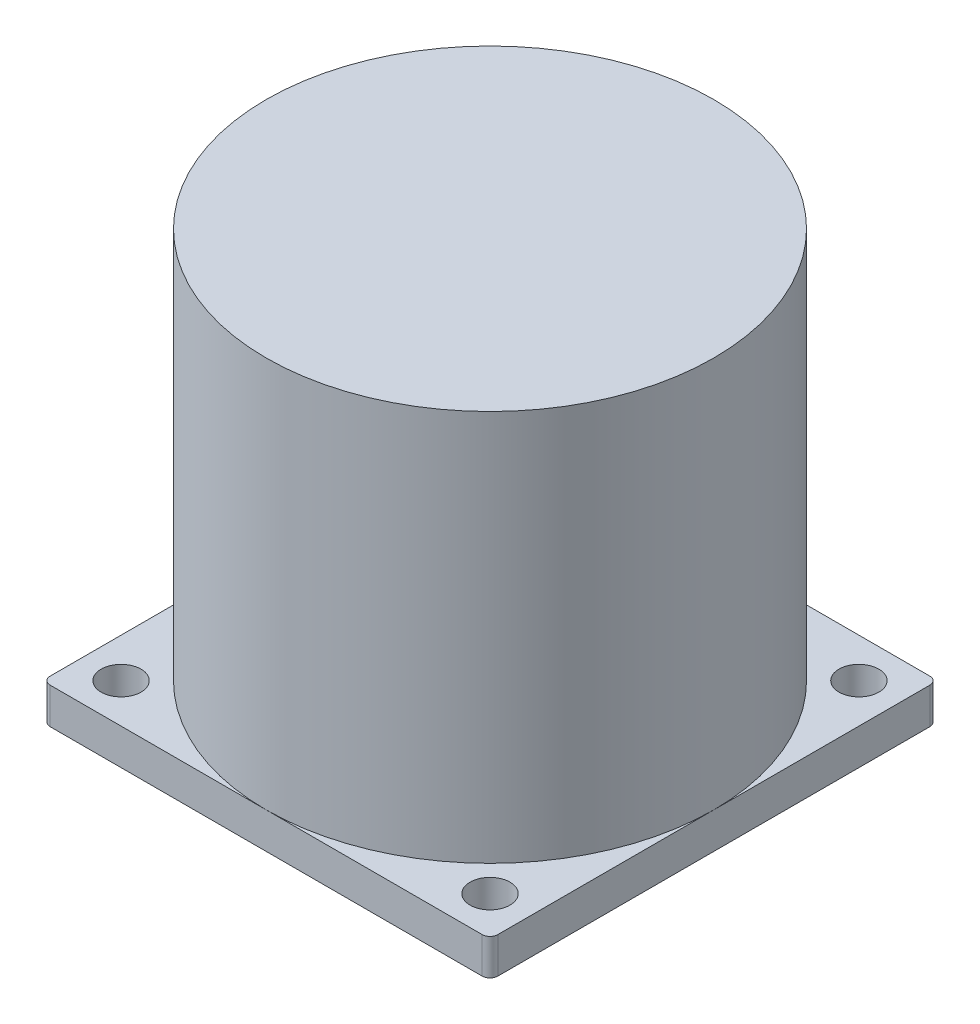
ISO-10303-21;
HEADER;
FILE_DESCRIPTION(('STEP AP214'),'2;1');
FILE_NAME('part.step','',(''),(''),'','','');
FILE_SCHEMA(('AUTOMOTIVE_DESIGN { 1 0 10303 214 1 1 1 1 }'));
ENDSEC;
DATA;
#1=APPLICATION_CONTEXT('core data for automotive mechanical design processes');
#2=APPLICATION_PROTOCOL_DEFINITION('international standard','automotive_design',2000,#1);
#3=PRODUCT_CONTEXT('',#1,'mechanical');
#4=PRODUCT('Part','Part','',(#3));
#5=PRODUCT_RELATED_PRODUCT_CATEGORY('part','',(#4));
#6=PRODUCT_DEFINITION_FORMATION('','',#4);
#7=PRODUCT_DEFINITION_CONTEXT('part definition',#1,'design');
#8=PRODUCT_DEFINITION('design','',#6,#7);
#9=PRODUCT_DEFINITION_SHAPE('','',#8);
#10=(LENGTH_UNIT() NAMED_UNIT(*) SI_UNIT(.MILLI.,.METRE.));
#11=(NAMED_UNIT(*) PLANE_ANGLE_UNIT() SI_UNIT($,.RADIAN.));
#12=(NAMED_UNIT(*) SI_UNIT($,.STERADIAN.) SOLID_ANGLE_UNIT());
#13=UNCERTAINTY_MEASURE_WITH_UNIT(LENGTH_MEASURE(1.E-05),#10,'distance_accuracy_value','');
#14=(GEOMETRIC_REPRESENTATION_CONTEXT(3) GLOBAL_UNCERTAINTY_ASSIGNED_CONTEXT((#13)) GLOBAL_UNIT_ASSIGNED_CONTEXT((#10,
#11,#12)) REPRESENTATION_CONTEXT('',''));
#15=CARTESIAN_POINT('',(0.,0.,0.));
#16=DIRECTION('',(0.,0.,1.));
#17=DIRECTION('',(1.,0.,0.));
#18=AXIS2_PLACEMENT_3D('',#15,#16,#17);
#19=CARTESIAN_POINT('',(0.,0.,0.));
#20=DIRECTION('',(0.,-1.,0.));
#21=DIRECTION('',(0.,0.,-1.));
#22=AXIS2_PLACEMENT_3D('',#19,#20,#21);
#23=PLANE('',#22);
#24=CARTESIAN_POINT('',(23.57,0.,-23.57));
#25=DIRECTION('',(0.,-1.,0.));
#26=DIRECTION('',(0.,0.,-1.));
#27=AXIS2_PLACEMENT_3D('',#24,#25,#26);
#28=CIRCLE('',#27,2.54999999999999);
#29=CARTESIAN_POINT('',(23.57,0.,-26.12));
#30=VERTEX_POINT('',#29);
#31=EDGE_CURVE('E227',#30,#30,#28,.T.);
#32=ORIENTED_EDGE('',*,*,#31,.T.);
#33=EDGE_LOOP('',(#32));
#34=FACE_BOUND('',#33,.T.);
#35=DIRECTION('',(0.,0.,1.));
#36=VECTOR('',#35,1.);
#37=CARTESIAN_POINT('',(28.6,0.,-28.6));
#38=LINE('',#37,#36);
#39=CARTESIAN_POINT('',(28.6,0.,-27.6));
#40=VERTEX_POINT('',#39);
#41=CARTESIAN_POINT('',(28.6,0.,0.));
#42=VERTEX_POINT('',#41);
#43=EDGE_CURVE('E113',#40,#42,#38,.T.);
#44=ORIENTED_EDGE('',*,*,#43,.F.);
#45=CARTESIAN_POINT('',(27.6,0.,-27.6));
#46=DIRECTION('',(0.,-1.,0.));
#47=DIRECTION('',(0.,0.,-1.));
#48=AXIS2_PLACEMENT_3D('',#45,#46,#47);
#49=CIRCLE('',#48,1.);
#50=CARTESIAN_POINT('',(27.6,0.,-28.6));
#51=VERTEX_POINT('',#50);
#52=EDGE_CURVE('E191',#40,#51,#49,.F.);
#53=ORIENTED_EDGE('',*,*,#52,.T.);
#54=DIRECTION('',(1.,0.,0.));
#55=VECTOR('',#54,1.);
#56=CARTESIAN_POINT('',(-28.6,0.,-28.6));
#57=LINE('',#56,#55);
#58=CARTESIAN_POINT('',(0.,0.,-28.6));
#59=VERTEX_POINT('',#58);
#60=EDGE_CURVE('E144',#59,#51,#57,.T.);
#61=ORIENTED_EDGE('',*,*,#60,.F.);
#62=CARTESIAN_POINT('',(0.,0.,0.));
#63=DIRECTION('',(0.,-1.,0.));
#64=DIRECTION('',(0.,0.,-1.));
#65=AXIS2_PLACEMENT_3D('',#62,#63,#64);
#66=CIRCLE('',#65,28.6);
#67=EDGE_CURVE('E135',#59,#42,#66,.T.);
#68=ORIENTED_EDGE('',*,*,#67,.T.);
#69=EDGE_LOOP('',(#44,#53,#61,#68));
#70=FACE_BOUND('',#69,.T.);
#71=ADVANCED_FACE('F35',(#34,#70),#23,.F.);
#72=CARTESIAN_POINT('',(23.57,0.,23.57));
#73=DIRECTION('',(0.,-1.,0.));
#74=DIRECTION('',(0.,0.,-1.));
#75=AXIS2_PLACEMENT_3D('',#72,#73,#74);
#76=CIRCLE('',#75,2.54999999999999);
#77=CARTESIAN_POINT('',(23.57,0.,21.02));
#78=VERTEX_POINT('',#77);
#79=EDGE_CURVE('E233',#78,#78,#76,.T.);
#80=ORIENTED_EDGE('',*,*,#79,.T.);
#81=EDGE_LOOP('',(#80));
#82=FACE_BOUND('',#81,.T.);
#83=DIRECTION('',(-1.,0.,0.));
#84=VECTOR('',#83,1.);
#85=CARTESIAN_POINT('',(28.6,0.,28.6));
#86=LINE('',#85,#84);
#87=CARTESIAN_POINT('',(27.6,0.,28.6));
#88=VERTEX_POINT('',#87);
#89=CARTESIAN_POINT('',(0.,0.,28.6));
#90=VERTEX_POINT('',#89);
#91=EDGE_CURVE('E214',#88,#90,#86,.T.);
#92=ORIENTED_EDGE('',*,*,#91,.F.);
#93=CARTESIAN_POINT('',(27.6,0.,27.6));
#94=DIRECTION('',(0.,-1.,0.));
#95=DIRECTION('',(0.,0.,-1.));
#96=AXIS2_PLACEMENT_3D('',#93,#94,#95);
#97=CIRCLE('',#96,1.);
#98=CARTESIAN_POINT('',(28.6,0.,27.6));
#99=VERTEX_POINT('',#98);
#100=EDGE_CURVE('E11',#88,#99,#97,.F.);
#101=ORIENTED_EDGE('',*,*,#100,.T.);
#102=EDGE_CURVE('E119',#42,#99,#38,.T.);
#103=ORIENTED_EDGE('',*,*,#102,.F.);
#104=EDGE_CURVE('E132',#42,#90,#66,.T.);
#105=ORIENTED_EDGE('',*,*,#104,.T.);
#106=EDGE_LOOP('',(#92,#101,#103,#105));
#107=FACE_BOUND('',#106,.T.);
#108=ADVANCED_FACE('F147',(#82,#107),#23,.F.);
#109=CARTESIAN_POINT('',(-23.57,0.,23.57));
#110=DIRECTION('',(0.,-1.,0.));
#111=DIRECTION('',(0.,0.,-1.));
#112=AXIS2_PLACEMENT_3D('',#109,#110,#111);
#113=CIRCLE('',#112,2.54999999999999);
#114=CARTESIAN_POINT('',(-23.57,0.,21.02));
#115=VERTEX_POINT('',#114);
#116=EDGE_CURVE('E239',#115,#115,#113,.T.);
#117=ORIENTED_EDGE('',*,*,#116,.T.);
#118=EDGE_LOOP('',(#117));
#119=FACE_BOUND('',#118,.T.);
#120=DIRECTION('',(0.,0.,-1.));
#121=VECTOR('',#120,1.);
#122=CARTESIAN_POINT('',(-28.6,0.,28.6));
#123=LINE('',#122,#121);
#124=CARTESIAN_POINT('',(-28.6,0.,27.6));
#125=VERTEX_POINT('',#124);
#126=CARTESIAN_POINT('',(-28.6,0.,0.));
#127=VERTEX_POINT('',#126);
#128=EDGE_CURVE('E210',#125,#127,#123,.T.);
#129=ORIENTED_EDGE('',*,*,#128,.F.);
#130=CARTESIAN_POINT('',(-27.6,0.,27.6));
#131=DIRECTION('',(0.,-1.,0.));
#132=DIRECTION('',(0.,0.,-1.));
#133=AXIS2_PLACEMENT_3D('',#130,#131,#132);
#134=CIRCLE('',#133,1.);
#135=CARTESIAN_POINT('',(-27.6,0.,28.6));
#136=VERTEX_POINT('',#135);
#137=EDGE_CURVE('E43',#125,#136,#134,.F.);
#138=ORIENTED_EDGE('',*,*,#137,.T.);
#139=EDGE_CURVE('E165',#90,#136,#86,.T.);
#140=ORIENTED_EDGE('',*,*,#139,.F.);
#141=EDGE_CURVE('E138',#90,#127,#66,.T.);
#142=ORIENTED_EDGE('',*,*,#141,.T.);
#143=EDGE_LOOP('',(#129,#138,#140,#142));
#144=FACE_BOUND('',#143,.T.);
#145=ADVANCED_FACE('F289',(#119,#144),#23,.F.);
#146=CARTESIAN_POINT('',(28.6,0.,28.6));
#147=DIRECTION('',(0.,0.,1.));
#148=DIRECTION('',(0.,-1.,0.));
#149=AXIS2_PLACEMENT_3D('',#146,#147,#148);
#150=PLANE('',#149);
#151=ORIENTED_EDGE('',*,*,#139,.T.);
#152=DIRECTION('',(0.,-1.,0.));
#153=VECTOR('',#152,1.);
#154=CARTESIAN_POINT('',(-27.6,0.,28.6));
#155=LINE('',#154,#153);
#156=CARTESIAN_POINT('',(-27.6,-4.59999999999999,28.6));
#157=VERTEX_POINT('',#156);
#158=EDGE_CURVE('E194',#136,#157,#155,.T.);
#159=ORIENTED_EDGE('',*,*,#158,.T.);
#160=DIRECTION('',(-1.,0.,0.));
#161=VECTOR('',#160,1.);
#162=CARTESIAN_POINT('',(28.6,-4.59999999999999,28.6));
#163=LINE('',#162,#161);
#164=CARTESIAN_POINT('',(27.6,-4.59999999999999,28.6));
#165=VERTEX_POINT('',#164);
#166=EDGE_CURVE('E153',#165,#157,#163,.T.);
#167=ORIENTED_EDGE('',*,*,#166,.F.);
#168=DIRECTION('',(0.,-1.,0.));
#169=VECTOR('',#168,1.);
#170=CARTESIAN_POINT('',(27.6,0.,28.6));
#171=LINE('',#170,#169);
#172=EDGE_CURVE('E57',#165,#88,#171,.F.);
#173=ORIENTED_EDGE('',*,*,#172,.T.);
#174=ORIENTED_EDGE('',*,*,#91,.T.);
#175=EDGE_LOOP('',(#151,#159,#167,#173,#174));
#176=FACE_BOUND('',#175,.T.);
#177=ADVANCED_FACE('F197',(#176),#150,.T.);
#178=CARTESIAN_POINT('',(28.6,0.,-28.6));
#179=DIRECTION('',(1.,0.,0.));
#180=DIRECTION('',(0.,0.,-1.));
#181=AXIS2_PLACEMENT_3D('',#178,#179,#180);
#182=PLANE('',#181);
#183=DIRECTION('',(0.,0.,1.));
#184=VECTOR('',#183,1.);
#185=CARTESIAN_POINT('',(28.6,-4.60000000000001,-28.6));
#186=LINE('',#185,#184);
#187=CARTESIAN_POINT('',(28.6,-4.60000000000001,-27.6));
#188=VERTEX_POINT('',#187);
#189=CARTESIAN_POINT('',(28.6,-4.59999999999999,27.6));
#190=VERTEX_POINT('',#189);
#191=EDGE_CURVE('E162',#188,#190,#186,.T.);
#192=ORIENTED_EDGE('',*,*,#191,.F.);
#193=DIRECTION('',(0.,-1.,0.));
#194=VECTOR('',#193,1.);
#195=CARTESIAN_POINT('',(28.6,0.,-27.6));
#196=LINE('',#195,#194);
#197=EDGE_CURVE('E122',#188,#40,#196,.F.);
#198=ORIENTED_EDGE('',*,*,#197,.T.);
#199=ORIENTED_EDGE('',*,*,#43,.T.);
#200=ORIENTED_EDGE('',*,*,#102,.T.);
#201=DIRECTION('',(0.,-1.,0.));
#202=VECTOR('',#201,1.);
#203=CARTESIAN_POINT('',(28.6,0.,27.6));
#204=LINE('',#203,#202);
#205=EDGE_CURVE('E188',#99,#190,#204,.T.);
#206=ORIENTED_EDGE('',*,*,#205,.T.);
#207=EDGE_LOOP('',(#192,#198,#199,#200,#206));
#208=FACE_BOUND('',#207,.T.);
#209=ADVANCED_FACE('F116',(#208),#182,.T.);
#210=CARTESIAN_POINT('',(-28.6,0.,-28.6));
#211=DIRECTION('',(0.,0.,-1.));
#212=DIRECTION('',(0.,1.,0.));
#213=AXIS2_PLACEMENT_3D('',#210,#211,#212);
#214=PLANE('',#213);
#215=DIRECTION('',(1.,0.,0.));
#216=VECTOR('',#215,1.);
#217=CARTESIAN_POINT('',(-28.6,-4.60000000000001,-28.6));
#218=LINE('',#217,#216);
#219=CARTESIAN_POINT('',(-27.6,-4.60000000000001,-28.6));
#220=VERTEX_POINT('',#219);
#221=CARTESIAN_POINT('',(27.6,-4.60000000000001,-28.6));
#222=VERTEX_POINT('',#221);
#223=EDGE_CURVE('E159',#220,#222,#218,.T.);
#224=ORIENTED_EDGE('',*,*,#223,.F.);
#225=DIRECTION('',(0.,-1.,0.));
#226=VECTOR('',#225,1.);
#227=CARTESIAN_POINT('',(-27.6,0.,-28.6));
#228=LINE('',#227,#226);
#229=CARTESIAN_POINT('',(-27.6,0.,-28.6));
#230=VERTEX_POINT('',#229);
#231=EDGE_CURVE('E184',#220,#230,#228,.F.);
#232=ORIENTED_EDGE('',*,*,#231,.T.);
#233=EDGE_CURVE('E149',#230,#59,#57,.T.);
#234=ORIENTED_EDGE('',*,*,#233,.T.);
#235=ORIENTED_EDGE('',*,*,#60,.T.);
#236=DIRECTION('',(0.,-1.,0.));
#237=VECTOR('',#236,1.);
#238=CARTESIAN_POINT('',(27.6,0.,-28.6));
#239=LINE('',#238,#237);
#240=EDGE_CURVE('E181',#51,#222,#239,.T.);
#241=ORIENTED_EDGE('',*,*,#240,.T.);
#242=EDGE_LOOP('',(#224,#232,#234,#235,#241));
#243=FACE_BOUND('',#242,.T.);
#244=ADVANCED_FACE('F208',(#243),#214,.T.);
#245=CARTESIAN_POINT('',(-28.6,0.,28.6));
#246=DIRECTION('',(-1.,0.,0.));
#247=DIRECTION('',(0.,0.,1.));
#248=AXIS2_PLACEMENT_3D('',#245,#246,#247);
#249=PLANE('',#248);
#250=CARTESIAN_POINT('',(-28.6,0.,-27.6));
#251=VERTEX_POINT('',#250);
#252=EDGE_CURVE('E211',#127,#251,#123,.T.);
#253=ORIENTED_EDGE('',*,*,#252,.T.);
#254=DIRECTION('',(0.,-1.,0.));
#255=VECTOR('',#254,1.);
#256=CARTESIAN_POINT('',(-28.6,0.,-27.6));
#257=LINE('',#256,#255);
#258=CARTESIAN_POINT('',(-28.6,-4.60000000000001,-27.6));
#259=VERTEX_POINT('',#258);
#260=EDGE_CURVE('E170',#251,#259,#257,.T.);
#261=ORIENTED_EDGE('',*,*,#260,.T.);
#262=DIRECTION('',(0.,0.,-1.));
#263=VECTOR('',#262,1.);
#264=CARTESIAN_POINT('',(-28.6,-4.59999999999999,28.6));
#265=LINE('',#264,#263);
#266=CARTESIAN_POINT('',(-28.6,-4.59999999999999,27.6));
#267=VERTEX_POINT('',#266);
#268=EDGE_CURVE('E156',#267,#259,#265,.T.);
#269=ORIENTED_EDGE('',*,*,#268,.F.);
#270=DIRECTION('',(0.,-1.,0.));
#271=VECTOR('',#270,1.);
#272=CARTESIAN_POINT('',(-28.6,0.,27.6));
#273=LINE('',#272,#271);
#274=EDGE_CURVE('E168',#267,#125,#273,.F.);
#275=ORIENTED_EDGE('',*,*,#274,.T.);
#276=ORIENTED_EDGE('',*,*,#128,.T.);
#277=EDGE_LOOP('',(#253,#261,#269,#275,#276));
#278=FACE_BOUND('',#277,.T.);
#279=ADVANCED_FACE('F293',(#278),#249,.T.);
#280=CARTESIAN_POINT('',(-23.57,0.,-23.57));
#281=DIRECTION('',(0.,-1.,0.));
#282=DIRECTION('',(0.,0.,-1.));
#283=AXIS2_PLACEMENT_3D('',#280,#281,#282);
#284=CIRCLE('',#283,2.54999999999999);
#285=CARTESIAN_POINT('',(-23.57,0.,-26.12));
#286=VERTEX_POINT('',#285);
#287=EDGE_CURVE('E245',#286,#286,#284,.T.);
#288=ORIENTED_EDGE('',*,*,#287,.T.);
#289=EDGE_LOOP('',(#288));
#290=FACE_BOUND('',#289,.T.);
#291=ORIENTED_EDGE('',*,*,#233,.F.);
#292=CARTESIAN_POINT('',(-27.6,0.,-27.6));
#293=DIRECTION('',(0.,-1.,0.));
#294=DIRECTION('',(0.,0.,-1.));
#295=AXIS2_PLACEMENT_3D('',#292,#293,#294);
#296=CIRCLE('',#295,1.);
#297=EDGE_CURVE('E186',#230,#251,#296,.F.);
#298=ORIENTED_EDGE('',*,*,#297,.T.);
#299=ORIENTED_EDGE('',*,*,#252,.F.);
#300=EDGE_CURVE('E126',#127,#59,#66,.T.);
#301=ORIENTED_EDGE('',*,*,#300,.T.);
#302=EDGE_LOOP('',(#291,#298,#299,#301));
#303=FACE_BOUND('',#302,.T.);
#304=ADVANCED_FACE('F257',(#290,#303),#23,.F.);
#305=CARTESIAN_POINT('',(0.,-4.6,0.));
#306=DIRECTION('',(0.,-1.,0.));
#307=DIRECTION('',(0.,0.,-1.));
#308=AXIS2_PLACEMENT_3D('',#305,#306,#307);
#309=PLANE('',#308);
#310=CARTESIAN_POINT('',(-23.57,-4.60000000000001,-23.57));
#311=DIRECTION('',(0.,-1.,0.));
#312=DIRECTION('',(0.,0.,-1.));
#313=AXIS2_PLACEMENT_3D('',#310,#311,#312);
#314=CIRCLE('',#313,2.54999999999999);
#315=CARTESIAN_POINT('',(-23.57,-4.60000000000001,-26.12));
#316=VERTEX_POINT('',#315);
#317=EDGE_CURVE('E248',#316,#316,#314,.T.);
#318=ORIENTED_EDGE('',*,*,#317,.F.);
#319=EDGE_LOOP('',(#318));
#320=FACE_BOUND('',#319,.T.);
#321=CARTESIAN_POINT('',(-23.57,-4.59999999999999,23.57));
#322=DIRECTION('',(0.,-1.,0.));
#323=DIRECTION('',(0.,0.,-1.));
#324=AXIS2_PLACEMENT_3D('',#321,#322,#323);
#325=CIRCLE('',#324,2.54999999999999);
#326=CARTESIAN_POINT('',(-23.57,-4.59999999999999,21.02));
#327=VERTEX_POINT('',#326);
#328=EDGE_CURVE('E242',#327,#327,#325,.T.);
#329=ORIENTED_EDGE('',*,*,#328,.F.);
#330=EDGE_LOOP('',(#329));
#331=FACE_BOUND('',#330,.T.);
#332=CARTESIAN_POINT('',(23.57,-4.59999999999999,23.57));
#333=DIRECTION('',(0.,-1.,0.));
#334=DIRECTION('',(0.,0.,-1.));
#335=AXIS2_PLACEMENT_3D('',#332,#333,#334);
#336=CIRCLE('',#335,2.54999999999999);
#337=CARTESIAN_POINT('',(23.57,-4.59999999999999,21.02));
#338=VERTEX_POINT('',#337);
#339=EDGE_CURVE('E236',#338,#338,#336,.T.);
#340=ORIENTED_EDGE('',*,*,#339,.F.);
#341=EDGE_LOOP('',(#340));
#342=FACE_BOUND('',#341,.T.);
#343=CARTESIAN_POINT('',(23.57,-4.60000000000001,-23.57));
#344=DIRECTION('',(0.,-1.,0.));
#345=DIRECTION('',(0.,0.,-1.));
#346=AXIS2_PLACEMENT_3D('',#343,#344,#345);
#347=CIRCLE('',#346,2.54999999999999);
#348=CARTESIAN_POINT('',(23.57,-4.60000000000001,-26.12));
#349=VERTEX_POINT('',#348);
#350=EDGE_CURVE('E230',#349,#349,#347,.T.);
#351=ORIENTED_EDGE('',*,*,#350,.F.);
#352=EDGE_LOOP('',(#351));
#353=FACE_BOUND('',#352,.T.);
#354=CARTESIAN_POINT('',(0.,-4.6,0.));
#355=DIRECTION('',(0.,-1.,0.));
#356=DIRECTION('',(0.,0.,-1.));
#357=AXIS2_PLACEMENT_3D('',#354,#355,#356);
#358=CIRCLE('',#357,19.05);
#359=CARTESIAN_POINT('',(0.,-4.60000000000001,-19.05));
#360=VERTEX_POINT('',#359);
#361=EDGE_CURVE('E140',#360,#360,#358,.T.);
#362=ORIENTED_EDGE('',*,*,#361,.F.);
#363=EDGE_LOOP('',(#362));
#364=FACE_BOUND('',#363,.T.);
#365=ORIENTED_EDGE('',*,*,#268,.T.);
#366=CARTESIAN_POINT('',(-27.6,-4.60000000000001,-27.6));
#367=DIRECTION('',(0.,-1.,0.));
#368=DIRECTION('',(0.,0.,-1.));
#369=AXIS2_PLACEMENT_3D('',#366,#367,#368);
#370=CIRCLE('',#369,1.);
#371=EDGE_CURVE('E179',#259,#220,#370,.T.);
#372=ORIENTED_EDGE('',*,*,#371,.T.);
#373=ORIENTED_EDGE('',*,*,#223,.T.);
#374=CARTESIAN_POINT('',(27.6,-4.60000000000001,-27.6));
#375=DIRECTION('',(0.,-1.,0.));
#376=DIRECTION('',(0.,0.,-1.));
#377=AXIS2_PLACEMENT_3D('',#374,#375,#376);
#378=CIRCLE('',#377,1.);
#379=EDGE_CURVE('E177',#222,#188,#378,.T.);
#380=ORIENTED_EDGE('',*,*,#379,.T.);
#381=ORIENTED_EDGE('',*,*,#191,.T.);
#382=CARTESIAN_POINT('',(27.6,-4.59999999999999,27.6));
#383=DIRECTION('',(0.,-1.,0.));
#384=DIRECTION('',(0.,0.,-1.));
#385=AXIS2_PLACEMENT_3D('',#382,#383,#384);
#386=CIRCLE('',#385,1.);
#387=EDGE_CURVE('E173',#190,#165,#386,.T.);
#388=ORIENTED_EDGE('',*,*,#387,.T.);
#389=ORIENTED_EDGE('',*,*,#166,.T.);
#390=CARTESIAN_POINT('',(-27.6,-4.59999999999999,27.6));
#391=DIRECTION('',(0.,-1.,0.));
#392=DIRECTION('',(0.,0.,-1.));
#393=AXIS2_PLACEMENT_3D('',#390,#391,#392);
#394=CIRCLE('',#393,1.);
#395=EDGE_CURVE('E175',#157,#267,#394,.T.);
#396=ORIENTED_EDGE('',*,*,#395,.T.);
#397=EDGE_LOOP('',(#365,#372,#373,#380,#381,#388,#389,#396));
#398=FACE_BOUND('',#397,.T.);
#399=ADVANCED_FACE('F200',(#320,#331,#342,#353,#364,#398),#309,.T.);
#400=CARTESIAN_POINT('',(0.,50.,0.));
#401=DIRECTION('',(0.,-1.,0.));
#402=DIRECTION('',(0.,0.,-1.));
#403=AXIS2_PLACEMENT_3D('',#400,#401,#402);
#404=CYLINDRICAL_SURFACE('',#403,28.6);
#405=CARTESIAN_POINT('',(0.,50.,0.));
#406=DIRECTION('',(0.,-1.,0.));
#407=DIRECTION('',(0.,0.,-1.));
#408=AXIS2_PLACEMENT_3D('',#405,#406,#407);
#409=CIRCLE('',#408,28.6);
#410=CARTESIAN_POINT('',(0.,50.,-28.6));
#411=VERTEX_POINT('',#410);
#412=EDGE_CURVE('E145',#411,#411,#409,.T.);
#413=ORIENTED_EDGE('',*,*,#412,.T.);
#414=EDGE_LOOP('',(#413));
#415=FACE_BOUND('',#414,.T.);
#416=ORIENTED_EDGE('',*,*,#67,.F.);
#417=ORIENTED_EDGE('',*,*,#300,.F.);
#418=ORIENTED_EDGE('',*,*,#141,.F.);
#419=ORIENTED_EDGE('',*,*,#104,.F.);
#420=EDGE_LOOP('',(#416,#417,#418,#419));
#421=FACE_BOUND('',#420,.T.);
#422=ADVANCED_FACE('F133',(#415,#421),#404,.T.);
#423=CARTESIAN_POINT('',(28.6,50.,0.));
#424=DIRECTION('',(0.,1.,0.));
#425=DIRECTION('',(0.,0.,1.));
#426=AXIS2_PLACEMENT_3D('',#423,#424,#425);
#427=PLANE('',#426);
#428=ORIENTED_EDGE('',*,*,#412,.F.);
#429=EDGE_LOOP('',(#428));
#430=FACE_BOUND('',#429,.T.);
#431=ADVANCED_FACE('F457',(#430),#427,.T.);
#432=CARTESIAN_POINT('',(0.,-25.2,0.));
#433=DIRECTION('',(0.,1.,0.));
#434=DIRECTION('',(0.,0.,1.));
#435=AXIS2_PLACEMENT_3D('',#432,#433,#434);
#436=CYLINDRICAL_SURFACE('',#435,3.175);
#437=CARTESIAN_POINT('',(0.,-25.2,0.));
#438=DIRECTION('',(0.,1.,0.));
#439=DIRECTION('',(0.,0.,1.));
#440=AXIS2_PLACEMENT_3D('',#437,#438,#439);
#441=CIRCLE('',#440,3.175);
#442=CARTESIAN_POINT('',(0.,-25.2,3.17500000000001));
#443=VERTEX_POINT('',#442);
#444=EDGE_CURVE('E146',#443,#443,#441,.T.);
#445=ORIENTED_EDGE('',*,*,#444,.T.);
#446=EDGE_LOOP('',(#445));
#447=FACE_BOUND('',#446,.T.);
#448=CARTESIAN_POINT('',(0.,-6.2,0.));
#449=DIRECTION('',(0.,1.,0.));
#450=DIRECTION('',(0.,0.,1.));
#451=AXIS2_PLACEMENT_3D('',#448,#449,#450);
#452=CIRCLE('',#451,3.175);
#453=CARTESIAN_POINT('',(0.,-6.2,3.175));
#454=VERTEX_POINT('',#453);
#455=EDGE_CURVE('E224',#454,#454,#452,.T.);
#456=ORIENTED_EDGE('',*,*,#455,.F.);
#457=EDGE_LOOP('',(#456));
#458=FACE_BOUND('',#457,.T.);
#459=ADVANCED_FACE('F280',(#447,#458),#436,.T.);
#460=CARTESIAN_POINT('',(3.175,-25.2,0.));
#461=DIRECTION('',(0.,-1.,0.));
#462=DIRECTION('',(0.,0.,-1.));
#463=AXIS2_PLACEMENT_3D('',#460,#461,#462);
#464=PLANE('',#463);
#465=ORIENTED_EDGE('',*,*,#444,.F.);
#466=EDGE_LOOP('',(#465));
#467=FACE_BOUND('',#466,.T.);
#468=ADVANCED_FACE('F270',(#467),#464,.T.);
#469=CARTESIAN_POINT('',(0.,-25.2,0.));
#470=DIRECTION('',(0.,1.,0.));
#471=DIRECTION('',(0.,0.,1.));
#472=AXIS2_PLACEMENT_3D('',#469,#470,#471);
#473=CYLINDRICAL_SURFACE('',#472,19.05);
#474=CARTESIAN_POINT('',(0.,-6.2,0.));
#475=DIRECTION('',(0.,1.,0.));
#476=DIRECTION('',(0.,0.,1.));
#477=AXIS2_PLACEMENT_3D('',#474,#475,#476);
#478=CIRCLE('',#477,19.05);
#479=CARTESIAN_POINT('',(0.,-6.19999999999999,19.05));
#480=VERTEX_POINT('',#479);
#481=EDGE_CURVE('E221',#480,#480,#478,.T.);
#482=ORIENTED_EDGE('',*,*,#481,.T.);
#483=EDGE_LOOP('',(#482));
#484=FACE_BOUND('',#483,.T.);
#485=ORIENTED_EDGE('',*,*,#361,.T.);
#486=EDGE_LOOP('',(#485));
#487=FACE_BOUND('',#486,.T.);
#488=ADVANCED_FACE('F267',(#484,#487),#473,.T.);
#489=CARTESIAN_POINT('',(19.05,-6.2,0.));
#490=DIRECTION('',(0.,-1.,0.));
#491=DIRECTION('',(0.,0.,-1.));
#492=AXIS2_PLACEMENT_3D('',#489,#490,#491);
#493=PLANE('',#492);
#494=ORIENTED_EDGE('',*,*,#455,.T.);
#495=EDGE_LOOP('',(#494));
#496=FACE_BOUND('',#495,.T.);
#497=ORIENTED_EDGE('',*,*,#481,.F.);
#498=EDGE_LOOP('',(#497));
#499=FACE_BOUND('',#498,.T.);
#500=ADVANCED_FACE('F269',(#496,#499),#493,.T.);
#501=CARTESIAN_POINT('',(23.57,-4.60000000000001,-23.57));
#502=DIRECTION('',(0.,-1.,0.));
#503=DIRECTION('',(0.,0.,-1.));
#504=AXIS2_PLACEMENT_3D('',#501,#502,#503);
#505=CYLINDRICAL_SURFACE('',#504,2.54999999999999);
#506=ORIENTED_EDGE('',*,*,#350,.T.);
#507=EDGE_LOOP('',(#506));
#508=FACE_BOUND('',#507,.T.);
#509=ORIENTED_EDGE('',*,*,#31,.F.);
#510=EDGE_LOOP('',(#509));
#511=FACE_BOUND('',#510,.T.);
#512=ADVANCED_FACE('F277',(#508,#511),#505,.F.);
#513=CARTESIAN_POINT('',(23.57,-4.59999999999999,23.57));
#514=DIRECTION('',(0.,-1.,0.));
#515=DIRECTION('',(0.,0.,-1.));
#516=AXIS2_PLACEMENT_3D('',#513,#514,#515);
#517=CYLINDRICAL_SURFACE('',#516,2.54999999999999);
#518=ORIENTED_EDGE('',*,*,#339,.T.);
#519=EDGE_LOOP('',(#518));
#520=FACE_BOUND('',#519,.T.);
#521=ORIENTED_EDGE('',*,*,#79,.F.);
#522=EDGE_LOOP('',(#521));
#523=FACE_BOUND('',#522,.T.);
#524=ADVANCED_FACE('F413',(#520,#523),#517,.F.);
#525=CARTESIAN_POINT('',(-23.57,-4.59999999999999,23.57));
#526=DIRECTION('',(0.,-1.,0.));
#527=DIRECTION('',(0.,0.,-1.));
#528=AXIS2_PLACEMENT_3D('',#525,#526,#527);
#529=CYLINDRICAL_SURFACE('',#528,2.54999999999999);
#530=ORIENTED_EDGE('',*,*,#328,.T.);
#531=EDGE_LOOP('',(#530));
#532=FACE_BOUND('',#531,.T.);
#533=ORIENTED_EDGE('',*,*,#116,.F.);
#534=EDGE_LOOP('',(#533));
#535=FACE_BOUND('',#534,.T.);
#536=ADVANCED_FACE('F322',(#532,#535),#529,.F.);
#537=CARTESIAN_POINT('',(-23.57,-4.60000000000001,-23.57));
#538=DIRECTION('',(0.,-1.,0.));
#539=DIRECTION('',(0.,0.,-1.));
#540=AXIS2_PLACEMENT_3D('',#537,#538,#539);
#541=CYLINDRICAL_SURFACE('',#540,2.54999999999999);
#542=ORIENTED_EDGE('',*,*,#317,.T.);
#543=EDGE_LOOP('',(#542));
#544=FACE_BOUND('',#543,.T.);
#545=ORIENTED_EDGE('',*,*,#287,.F.);
#546=EDGE_LOOP('',(#545));
#547=FACE_BOUND('',#546,.T.);
#548=ADVANCED_FACE('F252',(#544,#547),#541,.F.);
#549=CARTESIAN_POINT('',(-27.6,0.,-27.6));
#550=DIRECTION('',(0.,-1.,0.));
#551=DIRECTION('',(0.,0.,-1.));
#552=AXIS2_PLACEMENT_3D('',#549,#550,#551);
#553=CYLINDRICAL_SURFACE('',#552,1.);
#554=ORIENTED_EDGE('',*,*,#297,.F.);
#555=ORIENTED_EDGE('',*,*,#231,.F.);
#556=ORIENTED_EDGE('',*,*,#371,.F.);
#557=ORIENTED_EDGE('',*,*,#260,.F.);
#558=EDGE_LOOP('',(#554,#555,#556,#557));
#559=FACE_BOUND('',#558,.T.);
#560=ADVANCED_FACE('F314',(#559),#553,.T.);
#561=CARTESIAN_POINT('',(27.6,0.,-27.6));
#562=DIRECTION('',(0.,-1.,0.));
#563=DIRECTION('',(0.,0.,-1.));
#564=AXIS2_PLACEMENT_3D('',#561,#562,#563);
#565=CYLINDRICAL_SURFACE('',#564,1.);
#566=ORIENTED_EDGE('',*,*,#52,.F.);
#567=ORIENTED_EDGE('',*,*,#197,.F.);
#568=ORIENTED_EDGE('',*,*,#379,.F.);
#569=ORIENTED_EDGE('',*,*,#240,.F.);
#570=EDGE_LOOP('',(#566,#567,#568,#569));
#571=FACE_BOUND('',#570,.T.);
#572=ADVANCED_FACE('F204',(#571),#565,.T.);
#573=CARTESIAN_POINT('',(-27.6,0.,27.6));
#574=DIRECTION('',(0.,-1.,0.));
#575=DIRECTION('',(0.,0.,-1.));
#576=AXIS2_PLACEMENT_3D('',#573,#574,#575);
#577=CYLINDRICAL_SURFACE('',#576,1.);
#578=ORIENTED_EDGE('',*,*,#137,.F.);
#579=ORIENTED_EDGE('',*,*,#274,.F.);
#580=ORIENTED_EDGE('',*,*,#395,.F.);
#581=ORIENTED_EDGE('',*,*,#158,.F.);
#582=EDGE_LOOP('',(#578,#579,#580,#581));
#583=FACE_BOUND('',#582,.T.);
#584=ADVANCED_FACE('F309',(#583),#577,.T.);
#585=CARTESIAN_POINT('',(27.6,0.,27.6));
#586=DIRECTION('',(0.,-1.,0.));
#587=DIRECTION('',(0.,0.,-1.));
#588=AXIS2_PLACEMENT_3D('',#585,#586,#587);
#589=CYLINDRICAL_SURFACE('',#588,1.);
#590=ORIENTED_EDGE('',*,*,#100,.F.);
#591=ORIENTED_EDGE('',*,*,#172,.F.);
#592=ORIENTED_EDGE('',*,*,#387,.F.);
#593=ORIENTED_EDGE('',*,*,#205,.F.);
#594=EDGE_LOOP('',(#590,#591,#592,#593));
#595=FACE_BOUND('',#594,.T.);
#596=ADVANCED_FACE('F37',(#595),#589,.T.);
#597=CLOSED_SHELL('',(#71,#108,#145,#177,#209,#244,#279,#304,#399,#422,#431,#459,#468,#488,#500,
#512,#524,#536,#548,#560,#572,#584,#596));
#598=MANIFOLD_SOLID_BREP('B2',#597);
#599=ADVANCED_BREP_SHAPE_REPRESENTATION('',(#18,#598),#14);
#600=SHAPE_DEFINITION_REPRESENTATION(#9,#599);
ENDSEC;
END-ISO-10303-21;
